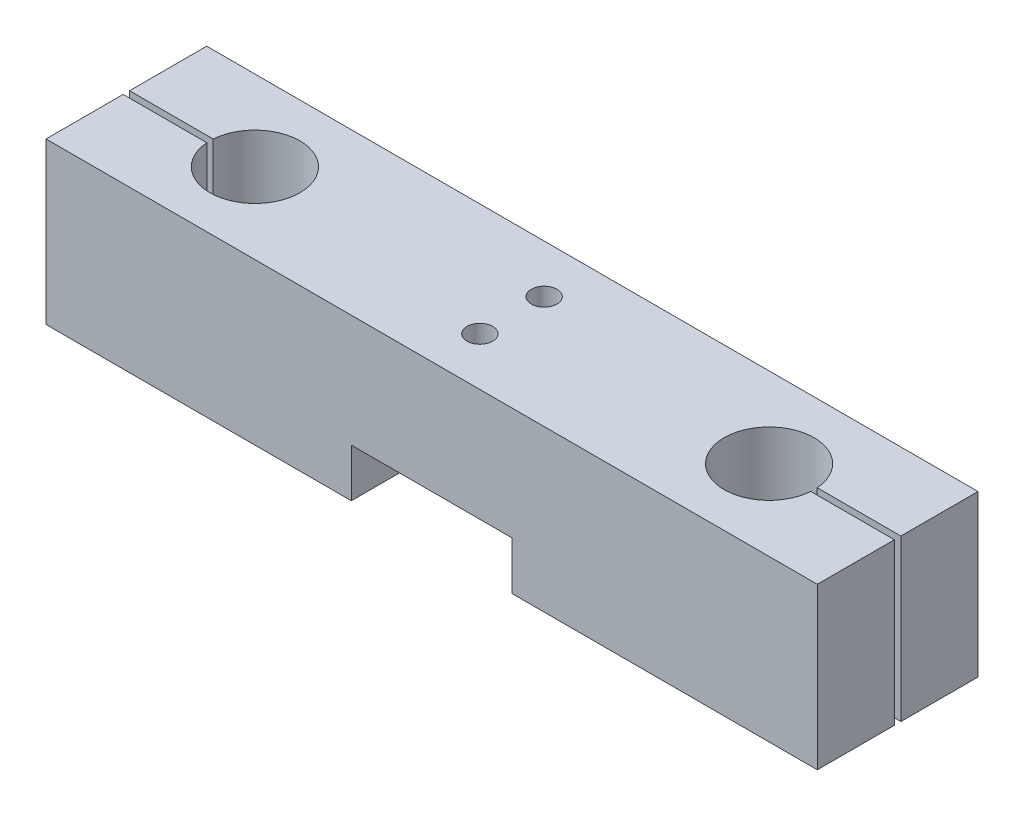
ISO-10303-21;
HEADER;
FILE_DESCRIPTION(('STEP AP214'),'2;1');
FILE_NAME('part.step','',(''),(''),'','','');
FILE_SCHEMA(('AUTOMOTIVE_DESIGN { 1 0 10303 214 1 1 1 1 }'));
ENDSEC;
DATA;
#1=APPLICATION_CONTEXT('core data for automotive mechanical design processes');
#2=APPLICATION_PROTOCOL_DEFINITION('international standard','automotive_design',2000,#1);
#3=PRODUCT_CONTEXT('',#1,'mechanical');
#4=PRODUCT('Part','Part','',(#3));
#5=PRODUCT_RELATED_PRODUCT_CATEGORY('part','',(#4));
#6=PRODUCT_DEFINITION_FORMATION('','',#4);
#7=PRODUCT_DEFINITION_CONTEXT('part definition',#1,'design');
#8=PRODUCT_DEFINITION('design','',#6,#7);
#9=PRODUCT_DEFINITION_SHAPE('','',#8);
#10=(LENGTH_UNIT() NAMED_UNIT(*) SI_UNIT(.MILLI.,.METRE.));
#11=(NAMED_UNIT(*) PLANE_ANGLE_UNIT() SI_UNIT($,.RADIAN.));
#12=(NAMED_UNIT(*) SI_UNIT($,.STERADIAN.) SOLID_ANGLE_UNIT());
#13=UNCERTAINTY_MEASURE_WITH_UNIT(LENGTH_MEASURE(1.E-05),#10,'distance_accuracy_value','');
#14=(GEOMETRIC_REPRESENTATION_CONTEXT(3) GLOBAL_UNCERTAINTY_ASSIGNED_CONTEXT((#13)) GLOBAL_UNIT_ASSIGNED_CONTEXT((#10,
#11,#12)) REPRESENTATION_CONTEXT('',''));
#15=CARTESIAN_POINT('',(0.,0.,0.));
#16=DIRECTION('',(0.,0.,1.));
#17=DIRECTION('',(1.,0.,0.));
#18=AXIS2_PLACEMENT_3D('',#15,#16,#17);
#19=CARTESIAN_POINT('',(40.,0.,-25.));
#20=DIRECTION('',(0.,1.,0.));
#21=DIRECTION('',(0.,0.,1.));
#22=AXIS2_PLACEMENT_3D('',#19,#20,#21);
#23=PLANE('',#22);
#24=DIRECTION('',(-1.,0.,0.));
#25=VECTOR('',#24,1.);
#26=CARTESIAN_POINT('',(0.,0.,-50.));
#27=LINE('',#26,#25);
#28=CARTESIAN_POINT('',(95.,0.,-50.));
#29=VERTEX_POINT('',#28);
#30=CARTESIAN_POINT('',(0.,0.,-50.));
#31=VERTEX_POINT('',#30);
#32=EDGE_CURVE('E188',#29,#31,#27,.T.);
#33=ORIENTED_EDGE('',*,*,#32,.F.);
#34=DIRECTION('',(0.,0.,-1.));
#35=VECTOR('',#34,1.);
#36=CARTESIAN_POINT('',(95.,0.,0.));
#37=LINE('',#36,#35);
#38=CARTESIAN_POINT('',(95.,0.,0.));
#39=VERTEX_POINT('',#38);
#40=EDGE_CURVE('E223',#39,#29,#37,.T.);
#41=ORIENTED_EDGE('',*,*,#40,.F.);
#42=DIRECTION('',(1.,0.,0.));
#43=VECTOR('',#42,1.);
#44=CARTESIAN_POINT('',(0.,0.,0.));
#45=LINE('',#44,#43);
#46=CARTESIAN_POINT('',(0.,0.,0.));
#47=VERTEX_POINT('',#46);
#48=EDGE_CURVE('E175',#47,#39,#45,.T.);
#49=ORIENTED_EDGE('',*,*,#48,.F.);
#50=DIRECTION('',(0.,0.,1.));
#51=VECTOR('',#50,1.);
#52=CARTESIAN_POINT('',(0.,0.,0.));
#53=LINE('',#52,#51);
#54=CARTESIAN_POINT('',(0.,0.,-24.));
#55=VERTEX_POINT('',#54);
#56=EDGE_CURVE('E170',#55,#47,#53,.T.);
#57=ORIENTED_EDGE('',*,*,#56,.F.);
#58=DIRECTION('',(-1.,0.,0.));
#59=VECTOR('',#58,1.);
#60=CARTESIAN_POINT('',(0.,0.,-24.));
#61=LINE('',#60,#59);
#62=CARTESIAN_POINT('',(26.0357599562311,0.,-24.));
#63=VERTEX_POINT('',#62);
#64=EDGE_CURVE('E106',#63,#55,#61,.T.);
#65=ORIENTED_EDGE('',*,*,#64,.F.);
#66=CARTESIAN_POINT('',(40.,0.,-25.));
#67=DIRECTION('',(0.,-1.,0.));
#68=DIRECTION('',(0.,0.,1.));
#69=AXIS2_PLACEMENT_3D('',#66,#67,#68);
#70=CIRCLE('',#69,14.);
#71=CARTESIAN_POINT('',(26.0357599562311,0.,-26.));
#72=VERTEX_POINT('',#71);
#73=EDGE_CURVE('E195',#72,#63,#70,.T.);
#74=ORIENTED_EDGE('',*,*,#73,.F.);
#75=DIRECTION('',(1.,0.,0.));
#76=VECTOR('',#75,1.);
#77=CARTESIAN_POINT('',(0.,0.,-26.));
#78=LINE('',#77,#76);
#79=CARTESIAN_POINT('',(0.,0.,-26.));
#80=VERTEX_POINT('',#79);
#81=EDGE_CURVE('E158',#80,#72,#78,.T.);
#82=ORIENTED_EDGE('',*,*,#81,.F.);
#83=DIRECTION('',(0.,0.,1.));
#84=VECTOR('',#83,1.);
#85=CARTESIAN_POINT('',(0.,0.,-26.));
#86=LINE('',#85,#84);
#87=EDGE_CURVE('E192',#31,#80,#86,.T.);
#88=ORIENTED_EDGE('',*,*,#87,.F.);
#89=EDGE_LOOP('',(#33,#41,#49,#57,#65,#74,#82,#88));
#90=FACE_BOUND('',#89,.T.);
#91=ADVANCED_FACE('F35',(#90),#23,.F.);
#92=CARTESIAN_POINT('',(0.,50.,0.));
#93=DIRECTION('',(1.,0.,0.));
#94=DIRECTION('',(0.,0.,-1.));
#95=AXIS2_PLACEMENT_3D('',#92,#93,#94);
#96=PLANE('',#95);
#97=ORIENTED_EDGE('',*,*,#56,.T.);
#98=DIRECTION('',(0.,-1.,0.));
#99=VECTOR('',#98,1.);
#100=CARTESIAN_POINT('',(0.,50.,0.));
#101=LINE('',#100,#99);
#102=CARTESIAN_POINT('',(0.,50.,0.));
#103=VERTEX_POINT('',#102);
#104=EDGE_CURVE('E11',#103,#47,#101,.T.);
#105=ORIENTED_EDGE('',*,*,#104,.F.);
#106=DIRECTION('',(0.,0.,1.));
#107=VECTOR('',#106,1.);
#108=CARTESIAN_POINT('',(0.,50.,0.));
#109=LINE('',#108,#107);
#110=CARTESIAN_POINT('',(0.,50.,-24.));
#111=VERTEX_POINT('',#110);
#112=EDGE_CURVE('E198',#111,#103,#109,.T.);
#113=ORIENTED_EDGE('',*,*,#112,.F.);
#114=DIRECTION('',(0.,-1.,0.));
#115=VECTOR('',#114,1.);
#116=CARTESIAN_POINT('',(0.,50.,-24.));
#117=LINE('',#116,#115);
#118=EDGE_CURVE('E166',#111,#55,#117,.T.);
#119=ORIENTED_EDGE('',*,*,#118,.T.);
#120=EDGE_LOOP('',(#97,#105,#113,#119));
#121=FACE_BOUND('',#120,.T.);
#122=ADVANCED_FACE('F37',(#121),#96,.F.);
#123=CARTESIAN_POINT('',(0.,50.,0.));
#124=DIRECTION('',(0.,0.,-1.));
#125=DIRECTION('',(-1.,0.,0.));
#126=AXIS2_PLACEMENT_3D('',#123,#124,#125);
#127=PLANE('',#126);
#128=ORIENTED_EDGE('',*,*,#48,.T.);
#129=DIRECTION('',(0.,-1.,0.));
#130=VECTOR('',#129,1.);
#131=CARTESIAN_POINT('',(95.,15.,0.));
#132=LINE('',#131,#130);
#133=CARTESIAN_POINT('',(95.,15.,0.));
#134=VERTEX_POINT('',#133);
#135=EDGE_CURVE('E174',#134,#39,#132,.T.);
#136=ORIENTED_EDGE('',*,*,#135,.F.);
#137=DIRECTION('',(-1.,0.,0.));
#138=VECTOR('',#137,1.);
#139=CARTESIAN_POINT('',(95.,15.,0.));
#140=LINE('',#139,#138);
#141=CARTESIAN_POINT('',(145.,15.,0.));
#142=VERTEX_POINT('',#141);
#143=EDGE_CURVE('E247',#142,#134,#140,.T.);
#144=ORIENTED_EDGE('',*,*,#143,.F.);
#145=DIRECTION('',(0.,-1.,0.));
#146=VECTOR('',#145,1.);
#147=CARTESIAN_POINT('',(145.,15.,0.));
#148=LINE('',#147,#146);
#149=CARTESIAN_POINT('',(145.,0.,0.));
#150=VERTEX_POINT('',#149);
#151=EDGE_CURVE('E254',#142,#150,#148,.T.);
#152=ORIENTED_EDGE('',*,*,#151,.T.);
#153=CARTESIAN_POINT('',(240.,0.,0.));
#154=VERTEX_POINT('',#153);
#155=EDGE_CURVE('E173',#150,#154,#45,.T.);
#156=ORIENTED_EDGE('',*,*,#155,.T.);
#157=DIRECTION('',(0.,-1.,0.));
#158=VECTOR('',#157,1.);
#159=CARTESIAN_POINT('',(240.,50.,0.));
#160=LINE('',#159,#158);
#161=CARTESIAN_POINT('',(240.,50.,0.));
#162=VERTEX_POINT('',#161);
#163=EDGE_CURVE('E44',#162,#154,#160,.T.);
#164=ORIENTED_EDGE('',*,*,#163,.F.);
#165=DIRECTION('',(1.,0.,0.));
#166=VECTOR('',#165,1.);
#167=CARTESIAN_POINT('',(0.,50.,0.));
#168=LINE('',#167,#166);
#169=EDGE_CURVE('E114',#103,#162,#168,.T.);
#170=ORIENTED_EDGE('',*,*,#169,.F.);
#171=ORIENTED_EDGE('',*,*,#104,.T.);
#172=EDGE_LOOP('',(#128,#136,#144,#152,#156,#164,#170,#171));
#173=FACE_BOUND('',#172,.T.);
#174=ADVANCED_FACE('F292',(#173),#127,.F.);
#175=CARTESIAN_POINT('',(240.,50.,0.));
#176=DIRECTION('',(-1.,0.,0.));
#177=DIRECTION('',(0.,0.,1.));
#178=AXIS2_PLACEMENT_3D('',#175,#176,#177);
#179=PLANE('',#178);
#180=DIRECTION('',(0.,0.,-1.));
#181=VECTOR('',#180,1.);
#182=CARTESIAN_POINT('',(240.,0.,0.));
#183=LINE('',#182,#181);
#184=CARTESIAN_POINT('',(240.,0.,-24.));
#185=VERTEX_POINT('',#184);
#186=EDGE_CURVE('E178',#154,#185,#183,.T.);
#187=ORIENTED_EDGE('',*,*,#186,.T.);
#188=DIRECTION('',(0.,-1.,0.));
#189=VECTOR('',#188,1.);
#190=CARTESIAN_POINT('',(240.,50.,-24.));
#191=LINE('',#190,#189);
#192=CARTESIAN_POINT('',(240.,50.,-24.));
#193=VERTEX_POINT('',#192);
#194=EDGE_CURVE('E217',#193,#185,#191,.T.);
#195=ORIENTED_EDGE('',*,*,#194,.F.);
#196=DIRECTION('',(0.,0.,-1.));
#197=VECTOR('',#196,1.);
#198=CARTESIAN_POINT('',(240.,50.,0.));
#199=LINE('',#198,#197);
#200=EDGE_CURVE('E262',#162,#193,#199,.T.);
#201=ORIENTED_EDGE('',*,*,#200,.F.);
#202=ORIENTED_EDGE('',*,*,#163,.T.);
#203=EDGE_LOOP('',(#187,#195,#201,#202));
#204=FACE_BOUND('',#203,.T.);
#205=ADVANCED_FACE('F296',(#204),#179,.F.);
#206=CARTESIAN_POINT('',(240.,50.,-24.));
#207=DIRECTION('',(0.,0.,1.));
#208=DIRECTION('',(1.,0.,0.));
#209=AXIS2_PLACEMENT_3D('',#206,#207,#208);
#210=PLANE('',#209);
#211=DIRECTION('',(-1.,0.,0.));
#212=VECTOR('',#211,1.);
#213=CARTESIAN_POINT('',(240.,0.,-24.));
#214=LINE('',#213,#212);
#215=CARTESIAN_POINT('',(213.964240043769,0.,-24.));
#216=VERTEX_POINT('',#215);
#217=EDGE_CURVE('E180',#185,#216,#214,.T.);
#218=ORIENTED_EDGE('',*,*,#217,.T.);
#219=DIRECTION('',(0.,-1.,0.));
#220=VECTOR('',#219,1.);
#221=CARTESIAN_POINT('',(213.964240043769,50.,-24.));
#222=LINE('',#221,#220);
#223=CARTESIAN_POINT('',(213.964240043769,50.,-24.));
#224=VERTEX_POINT('',#223);
#225=EDGE_CURVE('E214',#224,#216,#222,.T.);
#226=ORIENTED_EDGE('',*,*,#225,.F.);
#227=DIRECTION('',(-1.,0.,0.));
#228=VECTOR('',#227,1.);
#229=CARTESIAN_POINT('',(240.,50.,-24.));
#230=LINE('',#229,#228);
#231=EDGE_CURVE('E264',#193,#224,#230,.T.);
#232=ORIENTED_EDGE('',*,*,#231,.F.);
#233=ORIENTED_EDGE('',*,*,#194,.T.);
#234=EDGE_LOOP('',(#218,#226,#232,#233));
#235=FACE_BOUND('',#234,.T.);
#236=ADVANCED_FACE('F301',(#235),#210,.F.);
#237=CARTESIAN_POINT('',(200.,50.,-25.));
#238=DIRECTION('',(0.,-1.,0.));
#239=DIRECTION('',(0.,0.,-1.));
#240=AXIS2_PLACEMENT_3D('',#237,#238,#239);
#241=CYLINDRICAL_SURFACE('',#240,14.);
#242=CARTESIAN_POINT('',(200.,0.,-25.));
#243=DIRECTION('',(0.,-1.,0.));
#244=DIRECTION('',(0.,0.,1.));
#245=AXIS2_PLACEMENT_3D('',#242,#243,#244);
#246=CIRCLE('',#245,14.);
#247=CARTESIAN_POINT('',(213.964240043769,0.,-26.));
#248=VERTEX_POINT('',#247);
#249=EDGE_CURVE('E182',#216,#248,#246,.T.);
#250=ORIENTED_EDGE('',*,*,#249,.T.);
#251=DIRECTION('',(0.,-1.,0.));
#252=VECTOR('',#251,1.);
#253=CARTESIAN_POINT('',(213.964240043769,50.,-26.));
#254=LINE('',#253,#252);
#255=CARTESIAN_POINT('',(213.964240043769,50.,-26.));
#256=VERTEX_POINT('',#255);
#257=EDGE_CURVE('E211',#256,#248,#254,.T.);
#258=ORIENTED_EDGE('',*,*,#257,.F.);
#259=CARTESIAN_POINT('',(200.,50.,-25.));
#260=DIRECTION('',(0.,-1.,0.));
#261=DIRECTION('',(0.,0.,1.));
#262=AXIS2_PLACEMENT_3D('',#259,#260,#261);
#263=CIRCLE('',#262,14.);
#264=EDGE_CURVE('E266',#224,#256,#263,.T.);
#265=ORIENTED_EDGE('',*,*,#264,.F.);
#266=ORIENTED_EDGE('',*,*,#225,.T.);
#267=EDGE_LOOP('',(#250,#258,#265,#266));
#268=FACE_BOUND('',#267,.T.);
#269=ADVANCED_FACE('F307',(#268),#241,.F.);
#270=CARTESIAN_POINT('',(240.,50.,-26.));
#271=DIRECTION('',(0.,0.,-1.));
#272=DIRECTION('',(-1.,0.,0.));
#273=AXIS2_PLACEMENT_3D('',#270,#271,#272);
#274=PLANE('',#273);
#275=DIRECTION('',(1.,0.,0.));
#276=VECTOR('',#275,1.);
#277=CARTESIAN_POINT('',(240.,0.,-26.));
#278=LINE('',#277,#276);
#279=CARTESIAN_POINT('',(240.,0.,-26.));
#280=VERTEX_POINT('',#279);
#281=EDGE_CURVE('E184',#248,#280,#278,.T.);
#282=ORIENTED_EDGE('',*,*,#281,.T.);
#283=DIRECTION('',(0.,-1.,0.));
#284=VECTOR('',#283,1.);
#285=CARTESIAN_POINT('',(240.,50.,-26.));
#286=LINE('',#285,#284);
#287=CARTESIAN_POINT('',(240.,50.,-26.));
#288=VERTEX_POINT('',#287);
#289=EDGE_CURVE('E208',#288,#280,#286,.T.);
#290=ORIENTED_EDGE('',*,*,#289,.F.);
#291=DIRECTION('',(1.,0.,0.));
#292=VECTOR('',#291,1.);
#293=CARTESIAN_POINT('',(240.,50.,-26.));
#294=LINE('',#293,#292);
#295=EDGE_CURVE('E268',#256,#288,#294,.T.);
#296=ORIENTED_EDGE('',*,*,#295,.F.);
#297=ORIENTED_EDGE('',*,*,#257,.T.);
#298=EDGE_LOOP('',(#282,#290,#296,#297));
#299=FACE_BOUND('',#298,.T.);
#300=ADVANCED_FACE('F311',(#299),#274,.F.);
#301=CARTESIAN_POINT('',(240.,50.,-26.));
#302=DIRECTION('',(-1.,0.,0.));
#303=DIRECTION('',(0.,0.,1.));
#304=AXIS2_PLACEMENT_3D('',#301,#302,#303);
#305=PLANE('',#304);
#306=DIRECTION('',(0.,0.,-1.));
#307=VECTOR('',#306,1.);
#308=CARTESIAN_POINT('',(240.,0.,-26.));
#309=LINE('',#308,#307);
#310=CARTESIAN_POINT('',(240.,0.,-50.));
#311=VERTEX_POINT('',#310);
#312=EDGE_CURVE('E186',#280,#311,#309,.T.);
#313=ORIENTED_EDGE('',*,*,#312,.T.);
#314=DIRECTION('',(0.,-1.,0.));
#315=VECTOR('',#314,1.);
#316=CARTESIAN_POINT('',(240.,50.,-50.));
#317=LINE('',#316,#315);
#318=CARTESIAN_POINT('',(240.,50.,-50.));
#319=VERTEX_POINT('',#318);
#320=EDGE_CURVE('E205',#319,#311,#317,.T.);
#321=ORIENTED_EDGE('',*,*,#320,.F.);
#322=DIRECTION('',(0.,0.,-1.));
#323=VECTOR('',#322,1.);
#324=CARTESIAN_POINT('',(240.,50.,-26.));
#325=LINE('',#324,#323);
#326=EDGE_CURVE('E270',#288,#319,#325,.T.);
#327=ORIENTED_EDGE('',*,*,#326,.F.);
#328=ORIENTED_EDGE('',*,*,#289,.T.);
#329=EDGE_LOOP('',(#313,#321,#327,#328));
#330=FACE_BOUND('',#329,.T.);
#331=ADVANCED_FACE('F314',(#330),#305,.F.);
#332=CARTESIAN_POINT('',(0.,50.,-50.));
#333=DIRECTION('',(0.,0.,1.));
#334=DIRECTION('',(1.,0.,0.));
#335=AXIS2_PLACEMENT_3D('',#332,#333,#334);
#336=PLANE('',#335);
#337=DIRECTION('',(1.,0.,0.));
#338=VECTOR('',#337,1.);
#339=CARTESIAN_POINT('',(95.,15.,-50.));
#340=LINE('',#339,#338);
#341=CARTESIAN_POINT('',(95.,15.,-50.));
#342=VERTEX_POINT('',#341);
#343=CARTESIAN_POINT('',(145.,15.,-50.));
#344=VERTEX_POINT('',#343);
#345=EDGE_CURVE('E241',#342,#344,#340,.T.);
#346=ORIENTED_EDGE('',*,*,#345,.F.);
#347=DIRECTION('',(0.,-1.,0.));
#348=VECTOR('',#347,1.);
#349=CARTESIAN_POINT('',(95.,15.,-50.));
#350=LINE('',#349,#348);
#351=EDGE_CURVE('E249',#342,#29,#350,.T.);
#352=ORIENTED_EDGE('',*,*,#351,.T.);
#353=ORIENTED_EDGE('',*,*,#32,.T.);
#354=DIRECTION('',(0.,-1.,0.));
#355=VECTOR('',#354,1.);
#356=CARTESIAN_POINT('',(0.,50.,-50.));
#357=LINE('',#356,#355);
#358=CARTESIAN_POINT('',(0.,50.,-50.));
#359=VERTEX_POINT('',#358);
#360=EDGE_CURVE('E202',#359,#31,#357,.T.);
#361=ORIENTED_EDGE('',*,*,#360,.F.);
#362=DIRECTION('',(-1.,0.,0.));
#363=VECTOR('',#362,1.);
#364=CARTESIAN_POINT('',(0.,50.,-50.));
#365=LINE('',#364,#363);
#366=EDGE_CURVE('E272',#319,#359,#365,.T.);
#367=ORIENTED_EDGE('',*,*,#366,.F.);
#368=ORIENTED_EDGE('',*,*,#320,.T.);
#369=CARTESIAN_POINT('',(145.,0.,-50.));
#370=VERTEX_POINT('',#369);
#371=EDGE_CURVE('E189',#311,#370,#27,.T.);
#372=ORIENTED_EDGE('',*,*,#371,.T.);
#373=DIRECTION('',(0.,-1.,0.));
#374=VECTOR('',#373,1.);
#375=CARTESIAN_POINT('',(145.,15.,-50.));
#376=LINE('',#375,#374);
#377=EDGE_CURVE('E52',#344,#370,#376,.T.);
#378=ORIENTED_EDGE('',*,*,#377,.F.);
#379=EDGE_LOOP('',(#346,#352,#353,#361,#367,#368,#372,#378));
#380=FACE_BOUND('',#379,.T.);
#381=ADVANCED_FACE('F279',(#380),#336,.F.);
#382=CARTESIAN_POINT('',(0.,50.,-26.));
#383=DIRECTION('',(1.,0.,0.));
#384=DIRECTION('',(0.,0.,-1.));
#385=AXIS2_PLACEMENT_3D('',#382,#383,#384);
#386=PLANE('',#385);
#387=ORIENTED_EDGE('',*,*,#87,.T.);
#388=DIRECTION('',(0.,-1.,0.));
#389=VECTOR('',#388,1.);
#390=CARTESIAN_POINT('',(0.,50.,-26.));
#391=LINE('',#390,#389);
#392=CARTESIAN_POINT('',(0.,50.,-26.));
#393=VERTEX_POINT('',#392);
#394=EDGE_CURVE('E161',#393,#80,#391,.T.);
#395=ORIENTED_EDGE('',*,*,#394,.F.);
#396=DIRECTION('',(0.,0.,1.));
#397=VECTOR('',#396,1.);
#398=CARTESIAN_POINT('',(0.,50.,-26.));
#399=LINE('',#398,#397);
#400=EDGE_CURVE('E149',#359,#393,#399,.T.);
#401=ORIENTED_EDGE('',*,*,#400,.F.);
#402=ORIENTED_EDGE('',*,*,#360,.T.);
#403=EDGE_LOOP('',(#387,#395,#401,#402));
#404=FACE_BOUND('',#403,.T.);
#405=ADVANCED_FACE('F283',(#404),#386,.F.);
#406=CARTESIAN_POINT('',(0.,50.,-26.));
#407=DIRECTION('',(0.,0.,-1.));
#408=DIRECTION('',(-1.,0.,0.));
#409=AXIS2_PLACEMENT_3D('',#406,#407,#408);
#410=PLANE('',#409);
#411=ORIENTED_EDGE('',*,*,#81,.T.);
#412=DIRECTION('',(0.,-1.,0.));
#413=VECTOR('',#412,1.);
#414=CARTESIAN_POINT('',(26.0357599562311,50.,-26.));
#415=LINE('',#414,#413);
#416=CARTESIAN_POINT('',(26.0357599562311,50.,-26.));
#417=VERTEX_POINT('',#416);
#418=EDGE_CURVE('E155',#417,#72,#415,.T.);
#419=ORIENTED_EDGE('',*,*,#418,.F.);
#420=DIRECTION('',(1.,0.,0.));
#421=VECTOR('',#420,1.);
#422=CARTESIAN_POINT('',(0.,50.,-26.));
#423=LINE('',#422,#421);
#424=EDGE_CURVE('E142',#393,#417,#423,.T.);
#425=ORIENTED_EDGE('',*,*,#424,.F.);
#426=ORIENTED_EDGE('',*,*,#394,.T.);
#427=EDGE_LOOP('',(#411,#419,#425,#426));
#428=FACE_BOUND('',#427,.T.);
#429=ADVANCED_FACE('F156',(#428),#410,.F.);
#430=CARTESIAN_POINT('',(40.,50.,-25.));
#431=DIRECTION('',(0.,-1.,0.));
#432=DIRECTION('',(0.,0.,-1.));
#433=AXIS2_PLACEMENT_3D('',#430,#431,#432);
#434=CYLINDRICAL_SURFACE('',#433,14.);
#435=ORIENTED_EDGE('',*,*,#73,.T.);
#436=DIRECTION('',(0.,-1.,0.));
#437=VECTOR('',#436,1.);
#438=CARTESIAN_POINT('',(26.0357599562311,50.,-24.));
#439=LINE('',#438,#437);
#440=CARTESIAN_POINT('',(26.0357599562311,50.,-24.));
#441=VERTEX_POINT('',#440);
#442=EDGE_CURVE('E162',#441,#63,#439,.T.);
#443=ORIENTED_EDGE('',*,*,#442,.F.);
#444=CARTESIAN_POINT('',(40.,50.,-25.));
#445=DIRECTION('',(0.,-1.,0.));
#446=DIRECTION('',(0.,0.,1.));
#447=AXIS2_PLACEMENT_3D('',#444,#445,#446);
#448=CIRCLE('',#447,14.);
#449=EDGE_CURVE('E146',#417,#441,#448,.T.);
#450=ORIENTED_EDGE('',*,*,#449,.F.);
#451=ORIENTED_EDGE('',*,*,#418,.T.);
#452=EDGE_LOOP('',(#435,#443,#450,#451));
#453=FACE_BOUND('',#452,.T.);
#454=ADVANCED_FACE('F164',(#453),#434,.F.);
#455=CARTESIAN_POINT('',(0.,50.,-24.));
#456=DIRECTION('',(0.,0.,1.));
#457=DIRECTION('',(1.,0.,0.));
#458=AXIS2_PLACEMENT_3D('',#455,#456,#457);
#459=PLANE('',#458);
#460=ORIENTED_EDGE('',*,*,#64,.T.);
#461=ORIENTED_EDGE('',*,*,#118,.F.);
#462=DIRECTION('',(-1.,0.,0.));
#463=VECTOR('',#462,1.);
#464=CARTESIAN_POINT('',(0.,50.,-24.));
#465=LINE('',#464,#463);
#466=EDGE_CURVE('E61',#441,#111,#465,.T.);
#467=ORIENTED_EDGE('',*,*,#466,.F.);
#468=ORIENTED_EDGE('',*,*,#442,.T.);
#469=EDGE_LOOP('',(#460,#461,#467,#468));
#470=FACE_BOUND('',#469,.T.);
#471=ADVANCED_FACE('F286',(#470),#459,.F.);
#472=CARTESIAN_POINT('',(40.,50.,-25.));
#473=DIRECTION('',(0.,1.,0.));
#474=DIRECTION('',(0.,0.,1.));
#475=AXIS2_PLACEMENT_3D('',#472,#473,#474);
#476=PLANE('',#475);
#477=CARTESIAN_POINT('',(120.,50.,-15.));
#478=DIRECTION('',(0.,1.,0.));
#479=DIRECTION('',(0.,0.,1.));
#480=AXIS2_PLACEMENT_3D('',#477,#478,#479);
#481=CIRCLE('',#480,4.00000000000001);
#482=CARTESIAN_POINT('',(120.,50.,-11.));
#483=VERTEX_POINT('',#482);
#484=EDGE_CURVE('E235',#483,#483,#481,.T.);
#485=ORIENTED_EDGE('',*,*,#484,.F.);
#486=EDGE_LOOP('',(#485));
#487=FACE_BOUND('',#486,.T.);
#488=CARTESIAN_POINT('',(120.,50.,-35.));
#489=DIRECTION('',(0.,1.,0.));
#490=DIRECTION('',(0.,0.,1.));
#491=AXIS2_PLACEMENT_3D('',#488,#489,#490);
#492=CIRCLE('',#491,4.00000000000001);
#493=CARTESIAN_POINT('',(120.,50.,-31.));
#494=VERTEX_POINT('',#493);
#495=EDGE_CURVE('E224',#494,#494,#492,.T.);
#496=ORIENTED_EDGE('',*,*,#495,.F.);
#497=EDGE_LOOP('',(#496));
#498=FACE_BOUND('',#497,.T.);
#499=ORIENTED_EDGE('',*,*,#112,.T.);
#500=ORIENTED_EDGE('',*,*,#169,.T.);
#501=ORIENTED_EDGE('',*,*,#200,.T.);
#502=ORIENTED_EDGE('',*,*,#231,.T.);
#503=ORIENTED_EDGE('',*,*,#264,.T.);
#504=ORIENTED_EDGE('',*,*,#295,.T.);
#505=ORIENTED_EDGE('',*,*,#326,.T.);
#506=ORIENTED_EDGE('',*,*,#366,.T.);
#507=ORIENTED_EDGE('',*,*,#400,.T.);
#508=ORIENTED_EDGE('',*,*,#424,.T.);
#509=ORIENTED_EDGE('',*,*,#449,.T.);
#510=ORIENTED_EDGE('',*,*,#466,.T.);
#511=EDGE_LOOP('',(#499,#500,#501,#502,#503,#504,#505,#506,#507,#508,#509,#510));
#512=FACE_BOUND('',#511,.T.);
#513=ADVANCED_FACE('F144',(#487,#498,#512),#476,.T.);
#514=ORIENTED_EDGE('',*,*,#155,.F.);
#515=DIRECTION('',(0.,0.,1.));
#516=VECTOR('',#515,1.);
#517=CARTESIAN_POINT('',(145.,0.,0.));
#518=LINE('',#517,#516);
#519=EDGE_CURVE('E228',#370,#150,#518,.T.);
#520=ORIENTED_EDGE('',*,*,#519,.F.);
#521=ORIENTED_EDGE('',*,*,#371,.F.);
#522=ORIENTED_EDGE('',*,*,#312,.F.);
#523=ORIENTED_EDGE('',*,*,#281,.F.);
#524=ORIENTED_EDGE('',*,*,#249,.F.);
#525=ORIENTED_EDGE('',*,*,#217,.F.);
#526=ORIENTED_EDGE('',*,*,#186,.F.);
#527=EDGE_LOOP('',(#514,#520,#521,#522,#523,#524,#525,#526));
#528=FACE_BOUND('',#527,.T.);
#529=ADVANCED_FACE('F317',(#528),#23,.F.);
#530=CARTESIAN_POINT('',(95.,15.,0.));
#531=DIRECTION('',(-1.,0.,0.));
#532=DIRECTION('',(0.,0.,1.));
#533=AXIS2_PLACEMENT_3D('',#530,#531,#532);
#534=PLANE('',#533);
#535=ORIENTED_EDGE('',*,*,#40,.T.);
#536=ORIENTED_EDGE('',*,*,#351,.F.);
#537=DIRECTION('',(0.,0.,-1.));
#538=VECTOR('',#537,1.);
#539=CARTESIAN_POINT('',(95.,15.,0.));
#540=LINE('',#539,#538);
#541=EDGE_CURVE('E238',#134,#342,#540,.T.);
#542=ORIENTED_EDGE('',*,*,#541,.F.);
#543=ORIENTED_EDGE('',*,*,#135,.T.);
#544=EDGE_LOOP('',(#535,#536,#542,#543));
#545=FACE_BOUND('',#544,.T.);
#546=ADVANCED_FACE('F337',(#545),#534,.F.);
#547=CARTESIAN_POINT('',(145.,15.,0.));
#548=DIRECTION('',(1.,0.,0.));
#549=DIRECTION('',(0.,0.,-1.));
#550=AXIS2_PLACEMENT_3D('',#547,#548,#549);
#551=PLANE('',#550);
#552=ORIENTED_EDGE('',*,*,#519,.T.);
#553=ORIENTED_EDGE('',*,*,#151,.F.);
#554=DIRECTION('',(0.,0.,1.));
#555=VECTOR('',#554,1.);
#556=CARTESIAN_POINT('',(145.,15.,0.));
#557=LINE('',#556,#555);
#558=EDGE_CURVE('E244',#344,#142,#557,.T.);
#559=ORIENTED_EDGE('',*,*,#558,.F.);
#560=ORIENTED_EDGE('',*,*,#377,.T.);
#561=EDGE_LOOP('',(#552,#553,#559,#560));
#562=FACE_BOUND('',#561,.T.);
#563=ADVANCED_FACE('F320',(#562),#551,.F.);
#564=CARTESIAN_POINT('',(0.,15.,0.));
#565=DIRECTION('',(0.,-1.,0.));
#566=DIRECTION('',(0.,0.,-1.));
#567=AXIS2_PLACEMENT_3D('',#564,#565,#566);
#568=PLANE('',#567);
#569=CARTESIAN_POINT('',(120.,15.,-15.));
#570=DIRECTION('',(0.,-1.,0.));
#571=DIRECTION('',(0.,0.,-1.));
#572=AXIS2_PLACEMENT_3D('',#569,#570,#571);
#573=CIRCLE('',#572,4.00000000000001);
#574=CARTESIAN_POINT('',(120.,15.,-19.));
#575=VERTEX_POINT('',#574);
#576=EDGE_CURVE('E39',#575,#575,#573,.T.);
#577=ORIENTED_EDGE('',*,*,#576,.F.);
#578=EDGE_LOOP('',(#577));
#579=FACE_BOUND('',#578,.T.);
#580=CARTESIAN_POINT('',(120.,15.,-35.));
#581=DIRECTION('',(0.,-1.,0.));
#582=DIRECTION('',(0.,0.,-1.));
#583=AXIS2_PLACEMENT_3D('',#580,#581,#582);
#584=CIRCLE('',#583,4.00000000000001);
#585=CARTESIAN_POINT('',(120.,15.,-39.));
#586=VERTEX_POINT('',#585);
#587=EDGE_CURVE('E221',#586,#586,#584,.T.);
#588=ORIENTED_EDGE('',*,*,#587,.F.);
#589=EDGE_LOOP('',(#588));
#590=FACE_BOUND('',#589,.T.);
#591=ORIENTED_EDGE('',*,*,#541,.T.);
#592=ORIENTED_EDGE('',*,*,#345,.T.);
#593=ORIENTED_EDGE('',*,*,#558,.T.);
#594=ORIENTED_EDGE('',*,*,#143,.T.);
#595=EDGE_LOOP('',(#591,#592,#593,#594));
#596=FACE_BOUND('',#595,.T.);
#597=ADVANCED_FACE('F328',(#579,#590,#596),#568,.T.);
#598=CARTESIAN_POINT('',(120.,0.,-35.));
#599=DIRECTION('',(0.,1.,0.));
#600=DIRECTION('',(0.,0.,1.));
#601=AXIS2_PLACEMENT_3D('',#598,#599,#600);
#602=CYLINDRICAL_SURFACE('',#601,4.00000000000001);
#603=ORIENTED_EDGE('',*,*,#587,.T.);
#604=EDGE_LOOP('',(#603));
#605=FACE_BOUND('',#604,.T.);
#606=ORIENTED_EDGE('',*,*,#495,.T.);
#607=EDGE_LOOP('',(#606));
#608=FACE_BOUND('',#607,.T.);
#609=ADVANCED_FACE('F447',(#605,#608),#602,.F.);
#610=CARTESIAN_POINT('',(120.,0.,-15.));
#611=DIRECTION('',(0.,1.,0.));
#612=DIRECTION('',(0.,0.,1.));
#613=AXIS2_PLACEMENT_3D('',#610,#611,#612);
#614=CYLINDRICAL_SURFACE('',#613,4.00000000000001);
#615=ORIENTED_EDGE('',*,*,#576,.T.);
#616=EDGE_LOOP('',(#615));
#617=FACE_BOUND('',#616,.T.);
#618=ORIENTED_EDGE('',*,*,#484,.T.);
#619=EDGE_LOOP('',(#618));
#620=FACE_BOUND('',#619,.T.);
#621=ADVANCED_FACE('F454',(#617,#620),#614,.F.);
#622=CLOSED_SHELL('',(#91,#122,#174,#205,#236,#269,#300,#331,#381,#405,#429,#454,#471,#513,#529,
#546,#563,#597,#609,#621));
#623=MANIFOLD_SOLID_BREP('B2',#622);
#624=ADVANCED_BREP_SHAPE_REPRESENTATION('',(#18,#623),#14);
#625=SHAPE_DEFINITION_REPRESENTATION(#9,#624);
ENDSEC;
END-ISO-10303-21;
